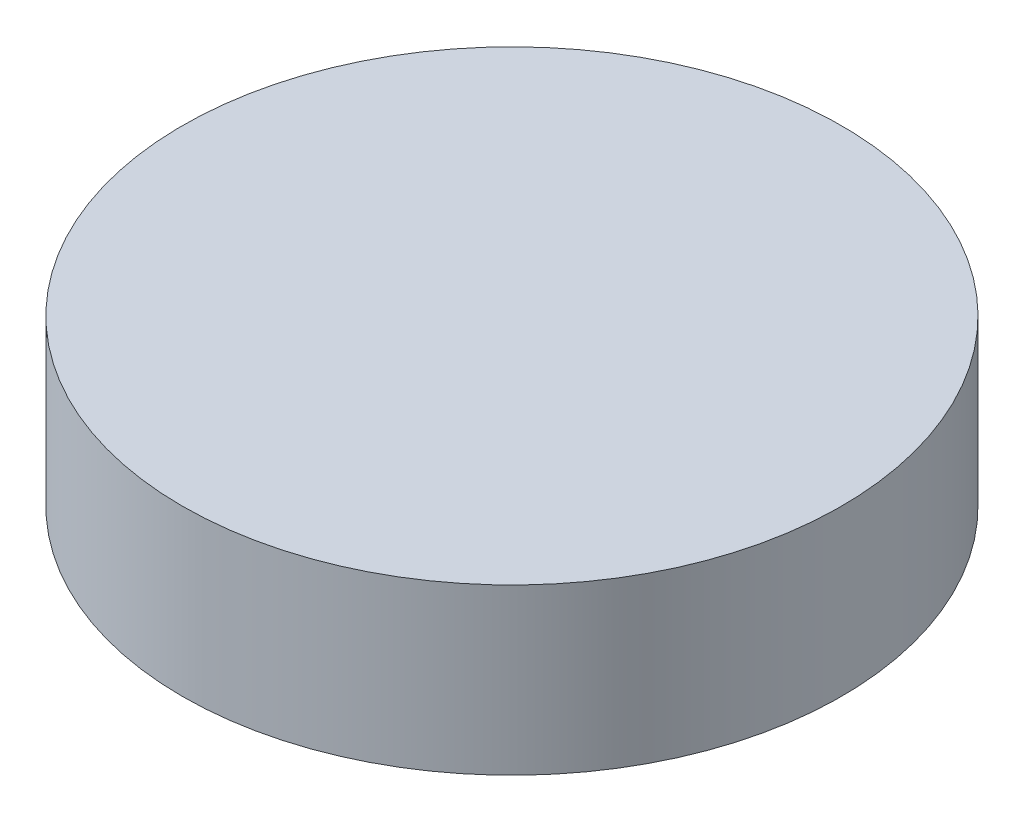
ISO-10303-21;
HEADER;
FILE_DESCRIPTION(('STEP AP214'),'2;1');
FILE_NAME('part.step','',(''),(''),'','','');
FILE_SCHEMA(('AUTOMOTIVE_DESIGN { 1 0 10303 214 1 1 1 1 }'));
ENDSEC;
DATA;
#1=APPLICATION_CONTEXT('core data for automotive mechanical design processes');
#2=APPLICATION_PROTOCOL_DEFINITION('international standard','automotive_design',2000,#1);
#3=PRODUCT_CONTEXT('',#1,'mechanical');
#4=PRODUCT('Part','Part','',(#3));
#5=PRODUCT_RELATED_PRODUCT_CATEGORY('part','',(#4));
#6=PRODUCT_DEFINITION_FORMATION('','',#4);
#7=PRODUCT_DEFINITION_CONTEXT('part definition',#1,'design');
#8=PRODUCT_DEFINITION('design','',#6,#7);
#9=PRODUCT_DEFINITION_SHAPE('','',#8);
#10=(LENGTH_UNIT() NAMED_UNIT(*) SI_UNIT(.MILLI.,.METRE.));
#11=(NAMED_UNIT(*) PLANE_ANGLE_UNIT() SI_UNIT($,.RADIAN.));
#12=(NAMED_UNIT(*) SI_UNIT($,.STERADIAN.) SOLID_ANGLE_UNIT());
#13=UNCERTAINTY_MEASURE_WITH_UNIT(LENGTH_MEASURE(1.E-05),#10,'distance_accuracy_value','');
#14=(GEOMETRIC_REPRESENTATION_CONTEXT(3) GLOBAL_UNCERTAINTY_ASSIGNED_CONTEXT((#13)) GLOBAL_UNIT_ASSIGNED_CONTEXT((#10,
#11,#12)) REPRESENTATION_CONTEXT('',''));
#15=CARTESIAN_POINT('',(0.,0.,0.));
#16=DIRECTION('',(0.,0.,1.));
#17=DIRECTION('',(1.,0.,0.));
#18=AXIS2_PLACEMENT_3D('',#15,#16,#17);
#19=CARTESIAN_POINT('',(0.,-2.54,0.));
#20=DIRECTION('',(0.,1.,0.));
#21=DIRECTION('',(0.,0.,1.));
#22=AXIS2_PLACEMENT_3D('',#19,#20,#21);
#23=CYLINDRICAL_SURFACE('',#22,10.16);
#24=CARTESIAN_POINT('',(0.,-2.54,0.));
#25=DIRECTION('',(0.,1.,0.));
#26=DIRECTION('',(0.,0.,1.));
#27=AXIS2_PLACEMENT_3D('',#24,#25,#26);
#28=CIRCLE('',#27,10.16);
#29=CARTESIAN_POINT('',(0.,-2.54,10.16));
#30=VERTEX_POINT('',#29);
#31=EDGE_CURVE('E10',#30,#30,#28,.T.);
#32=ORIENTED_EDGE('',*,*,#31,.T.);
#33=EDGE_LOOP('',(#32));
#34=FACE_BOUND('',#33,.T.);
#35=CARTESIAN_POINT('',(0.,2.54,0.));
#36=DIRECTION('',(0.,1.,0.));
#37=DIRECTION('',(0.,0.,1.));
#38=AXIS2_PLACEMENT_3D('',#35,#36,#37);
#39=CIRCLE('',#38,10.16);
#40=CARTESIAN_POINT('',(0.,2.54,10.16));
#41=VERTEX_POINT('',#40);
#42=EDGE_CURVE('E48',#41,#41,#39,.T.);
#43=ORIENTED_EDGE('',*,*,#42,.F.);
#44=EDGE_LOOP('',(#43));
#45=FACE_BOUND('',#44,.T.);
#46=ADVANCED_FACE('F41',(#34,#45),#23,.T.);
#47=CARTESIAN_POINT('',(0.,-2.54,0.));
#48=DIRECTION('',(0.,1.,0.));
#49=DIRECTION('',(0.,0.,1.));
#50=AXIS2_PLACEMENT_3D('',#47,#48,#49);
#51=PLANE('',#50);
#52=ORIENTED_EDGE('',*,*,#31,.F.);
#53=EDGE_LOOP('',(#52));
#54=FACE_BOUND('',#53,.T.);
#55=ADVANCED_FACE('F58',(#54),#51,.F.);
#56=CARTESIAN_POINT('',(0.,2.54,0.));
#57=DIRECTION('',(0.,1.,0.));
#58=DIRECTION('',(0.,0.,1.));
#59=AXIS2_PLACEMENT_3D('',#56,#57,#58);
#60=PLANE('',#59);
#61=ORIENTED_EDGE('',*,*,#42,.T.);
#62=EDGE_LOOP('',(#61));
#63=FACE_BOUND('',#62,.T.);
#64=ADVANCED_FACE('F55',(#63),#60,.T.);
#65=CLOSED_SHELL('',(#46,#55,#64));
#66=MANIFOLD_SOLID_BREP('B2',#65);
#67=ADVANCED_BREP_SHAPE_REPRESENTATION('',(#18,#66),#14);
#68=SHAPE_DEFINITION_REPRESENTATION(#9,#67);
ENDSEC;
END-ISO-10303-21;
